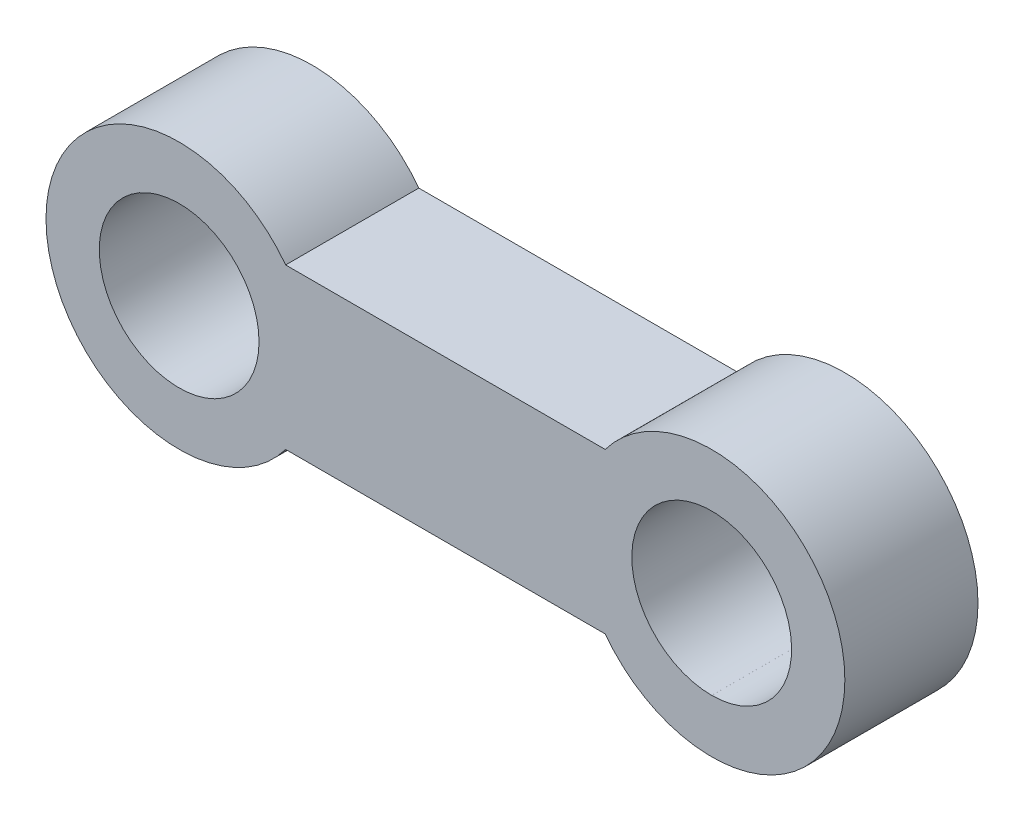
ISO-10303-21;
HEADER;
FILE_DESCRIPTION(('STEP AP214'),'2;1');
FILE_NAME('part.step','',(''),(''),'','','');
FILE_SCHEMA(('AUTOMOTIVE_DESIGN { 1 0 10303 214 1 1 1 1 }'));
ENDSEC;
DATA;
#1=APPLICATION_CONTEXT('core data for automotive mechanical design processes');
#2=APPLICATION_PROTOCOL_DEFINITION('international standard','automotive_design',2000,#1);
#3=PRODUCT_CONTEXT('',#1,'mechanical');
#4=PRODUCT('Part','Part','',(#3));
#5=PRODUCT_RELATED_PRODUCT_CATEGORY('part','',(#4));
#6=PRODUCT_DEFINITION_FORMATION('','',#4);
#7=PRODUCT_DEFINITION_CONTEXT('part definition',#1,'design');
#8=PRODUCT_DEFINITION('design','',#6,#7);
#9=PRODUCT_DEFINITION_SHAPE('','',#8);
#10=(LENGTH_UNIT() NAMED_UNIT(*) SI_UNIT(.MILLI.,.METRE.));
#11=(NAMED_UNIT(*) PLANE_ANGLE_UNIT() SI_UNIT($,.RADIAN.));
#12=(NAMED_UNIT(*) SI_UNIT($,.STERADIAN.) SOLID_ANGLE_UNIT());
#13=UNCERTAINTY_MEASURE_WITH_UNIT(LENGTH_MEASURE(1.E-05),#10,'distance_accuracy_value','');
#14=(GEOMETRIC_REPRESENTATION_CONTEXT(3) GLOBAL_UNCERTAINTY_ASSIGNED_CONTEXT((#13)) GLOBAL_UNIT_ASSIGNED_CONTEXT((#10,
#11,#12)) REPRESENTATION_CONTEXT('',''));
#15=CARTESIAN_POINT('',(0.,0.,0.));
#16=DIRECTION('',(0.,0.,1.));
#17=DIRECTION('',(1.,0.,0.));
#18=AXIS2_PLACEMENT_3D('',#15,#16,#17);
#19=CARTESIAN_POINT('',(0.,-3.,5.));
#20=DIRECTION('',(0.,1.,0.));
#21=DIRECTION('',(0.,0.,1.));
#22=AXIS2_PLACEMENT_3D('',#19,#20,#21);
#23=PLANE('',#22);
#24=DIRECTION('',(1.,0.,0.));
#25=VECTOR('',#24,1.);
#26=CARTESIAN_POINT('',(0.,-3.,0.));
#27=LINE('',#26,#25);
#28=CARTESIAN_POINT('',(4.,-3.,0.));
#29=VERTEX_POINT('',#28);
#30=CARTESIAN_POINT('',(16.,-3.,0.));
#31=VERTEX_POINT('',#30);
#32=EDGE_CURVE('E124',#29,#31,#27,.T.);
#33=ORIENTED_EDGE('',*,*,#32,.T.);
#34=DIRECTION('',(0.,0.,-1.));
#35=VECTOR('',#34,1.);
#36=CARTESIAN_POINT('',(16.,-3.,5.));
#37=LINE('',#36,#35);
#38=CARTESIAN_POINT('',(16.,-3.,5.));
#39=VERTEX_POINT('',#38);
#40=EDGE_CURVE('E11',#39,#31,#37,.T.);
#41=ORIENTED_EDGE('',*,*,#40,.F.);
#42=DIRECTION('',(1.,0.,0.));
#43=VECTOR('',#42,1.);
#44=CARTESIAN_POINT('',(0.,-3.,5.));
#45=LINE('',#44,#43);
#46=CARTESIAN_POINT('',(4.,-3.,5.));
#47=VERTEX_POINT('',#46);
#48=EDGE_CURVE('E98',#47,#39,#45,.T.);
#49=ORIENTED_EDGE('',*,*,#48,.F.);
#50=DIRECTION('',(0.,0.,-1.));
#51=VECTOR('',#50,1.);
#52=CARTESIAN_POINT('',(4.,-3.,5.));
#53=LINE('',#52,#51);
#54=EDGE_CURVE('E132',#47,#29,#53,.T.);
#55=ORIENTED_EDGE('',*,*,#54,.T.);
#56=EDGE_LOOP('',(#33,#41,#49,#55));
#57=FACE_BOUND('',#56,.T.);
#58=ADVANCED_FACE('F33',(#57),#23,.F.);
#59=CARTESIAN_POINT('',(20.,0.,5.));
#60=DIRECTION('',(0.,0.,-1.));
#61=DIRECTION('',(-1.,0.,0.));
#62=AXIS2_PLACEMENT_3D('',#59,#60,#61);
#63=CYLINDRICAL_SURFACE('',#62,5.);
#64=CARTESIAN_POINT('',(20.,0.,0.));
#65=DIRECTION('',(0.,0.,1.));
#66=DIRECTION('',(1.,0.,0.));
#67=AXIS2_PLACEMENT_3D('',#64,#65,#66);
#68=CIRCLE('',#67,5.);
#69=CARTESIAN_POINT('',(16.,3.,0.));
#70=VERTEX_POINT('',#69);
#71=EDGE_CURVE('E104',#31,#70,#68,.T.);
#72=ORIENTED_EDGE('',*,*,#71,.T.);
#73=DIRECTION('',(0.,0.,-1.));
#74=VECTOR('',#73,1.);
#75=CARTESIAN_POINT('',(16.,3.,5.));
#76=LINE('',#75,#74);
#77=CARTESIAN_POINT('',(16.,3.,5.));
#78=VERTEX_POINT('',#77);
#79=EDGE_CURVE('E43',#78,#70,#76,.T.);
#80=ORIENTED_EDGE('',*,*,#79,.F.);
#81=CARTESIAN_POINT('',(20.,0.,5.));
#82=DIRECTION('',(0.,0.,1.));
#83=DIRECTION('',(1.,0.,0.));
#84=AXIS2_PLACEMENT_3D('',#81,#82,#83);
#85=CIRCLE('',#84,5.);
#86=EDGE_CURVE('E92',#39,#78,#85,.T.);
#87=ORIENTED_EDGE('',*,*,#86,.F.);
#88=ORIENTED_EDGE('',*,*,#40,.T.);
#89=EDGE_LOOP('',(#72,#80,#87,#88));
#90=FACE_BOUND('',#89,.T.);
#91=ADVANCED_FACE('F103',(#90),#63,.T.);
#92=CARTESIAN_POINT('',(0.,3.,5.));
#93=DIRECTION('',(0.,1.,0.));
#94=DIRECTION('',(0.,0.,1.));
#95=AXIS2_PLACEMENT_3D('',#92,#93,#94);
#96=PLANE('',#95);
#97=DIRECTION('',(1.,0.,0.));
#98=VECTOR('',#97,1.);
#99=CARTESIAN_POINT('',(0.,3.,0.));
#100=LINE('',#99,#98);
#101=CARTESIAN_POINT('',(4.,3.,0.));
#102=VERTEX_POINT('',#101);
#103=EDGE_CURVE('E128',#102,#70,#100,.T.);
#104=ORIENTED_EDGE('',*,*,#103,.F.);
#105=DIRECTION('',(0.,0.,-1.));
#106=VECTOR('',#105,1.);
#107=CARTESIAN_POINT('',(4.,3.,5.));
#108=LINE('',#107,#106);
#109=CARTESIAN_POINT('',(4.,3.,5.));
#110=VERTEX_POINT('',#109);
#111=EDGE_CURVE('E74',#110,#102,#108,.T.);
#112=ORIENTED_EDGE('',*,*,#111,.F.);
#113=DIRECTION('',(1.,0.,0.));
#114=VECTOR('',#113,1.);
#115=CARTESIAN_POINT('',(0.,3.,5.));
#116=LINE('',#115,#114);
#117=EDGE_CURVE('E96',#110,#78,#116,.T.);
#118=ORIENTED_EDGE('',*,*,#117,.T.);
#119=ORIENTED_EDGE('',*,*,#79,.T.);
#120=EDGE_LOOP('',(#104,#112,#118,#119));
#121=FACE_BOUND('',#120,.T.);
#122=ADVANCED_FACE('F109',(#121),#96,.T.);
#123=CARTESIAN_POINT('',(20.,0.,5.));
#124=DIRECTION('',(0.,0.,-1.));
#125=DIRECTION('',(-1.,0.,0.));
#126=AXIS2_PLACEMENT_3D('',#123,#124,#125);
#127=CYLINDRICAL_SURFACE('',#126,3.);
#128=CARTESIAN_POINT('',(20.,0.,0.));
#129=DIRECTION('',(0.,0.,1.));
#130=DIRECTION('',(1.,0.,0.));
#131=AXIS2_PLACEMENT_3D('',#128,#129,#130);
#132=CIRCLE('',#131,3.);
#133=CARTESIAN_POINT('',(20.0018338843937,-3.,0.));
#134=VERTEX_POINT('',#133);
#135=CARTESIAN_POINT('',(20.,-3.,0.));
#136=VERTEX_POINT('',#135);
#137=EDGE_CURVE('E115',#134,#136,#132,.T.);
#138=ORIENTED_EDGE('',*,*,#137,.F.);
#139=DIRECTION('',(0.,0.,-1.));
#140=VECTOR('',#139,1.);
#141=CARTESIAN_POINT('',(20.0018338843937,-3.,5.));
#142=LINE('',#141,#140);
#143=CARTESIAN_POINT('',(20.0018338843937,-3.,5.));
#144=VERTEX_POINT('',#143);
#145=EDGE_CURVE('E37',#144,#134,#142,.T.);
#146=ORIENTED_EDGE('',*,*,#145,.F.);
#147=CARTESIAN_POINT('',(20.,0.,5.));
#148=DIRECTION('',(0.,0.,1.));
#149=DIRECTION('',(1.,0.,0.));
#150=AXIS2_PLACEMENT_3D('',#147,#148,#149);
#151=CIRCLE('',#150,3.);
#152=CARTESIAN_POINT('',(20.,-3.,5.));
#153=VERTEX_POINT('',#152);
#154=EDGE_CURVE('E131',#144,#153,#151,.T.);
#155=ORIENTED_EDGE('',*,*,#154,.T.);
#156=DIRECTION('',(0.,0.,-1.));
#157=VECTOR('',#156,1.);
#158=CARTESIAN_POINT('',(20.,-3.,5.));
#159=LINE('',#158,#157);
#160=EDGE_CURVE('E111',#153,#136,#159,.T.);
#161=ORIENTED_EDGE('',*,*,#160,.T.);
#162=EDGE_LOOP('',(#138,#146,#155,#161));
#163=FACE_BOUND('',#162,.T.);
#164=ADVANCED_FACE('F35',(#163),#127,.F.);
#165=CARTESIAN_POINT('',(0.,0.,5.));
#166=DIRECTION('',(0.,0.,-1.));
#167=DIRECTION('',(-1.,0.,0.));
#168=AXIS2_PLACEMENT_3D('',#165,#166,#167);
#169=CYLINDRICAL_SURFACE('',#168,3.);
#170=CARTESIAN_POINT('',(0.,0.,5.));
#171=DIRECTION('',(0.,0.,1.));
#172=DIRECTION('',(1.,0.,0.));
#173=AXIS2_PLACEMENT_3D('',#170,#171,#172);
#174=CIRCLE('',#173,3.);
#175=CARTESIAN_POINT('',(3.,0.,5.));
#176=VERTEX_POINT('',#175);
#177=EDGE_CURVE('E175',#176,#176,#174,.T.);
#178=ORIENTED_EDGE('',*,*,#177,.T.);
#179=EDGE_LOOP('',(#178));
#180=FACE_BOUND('',#179,.T.);
#181=CARTESIAN_POINT('',(0.,0.,0.));
#182=DIRECTION('',(0.,0.,1.));
#183=DIRECTION('',(1.,0.,0.));
#184=AXIS2_PLACEMENT_3D('',#181,#182,#183);
#185=CIRCLE('',#184,3.);
#186=CARTESIAN_POINT('',(3.,0.,0.));
#187=VERTEX_POINT('',#186);
#188=EDGE_CURVE('E121',#187,#187,#185,.T.);
#189=ORIENTED_EDGE('',*,*,#188,.F.);
#190=EDGE_LOOP('',(#189));
#191=FACE_BOUND('',#190,.T.);
#192=ADVANCED_FACE('F158',(#180,#191),#169,.F.);
#193=CARTESIAN_POINT('',(0.,-3.,5.));
#194=DIRECTION('',(0.,1.,0.));
#195=DIRECTION('',(0.,0.,1.));
#196=AXIS2_PLACEMENT_3D('',#193,#194,#195);
#197=PLANE('',#196);
#198=DIRECTION('',(1.,0.,0.));
#199=VECTOR('',#198,1.);
#200=CARTESIAN_POINT('',(0.,-3.,0.));
#201=LINE('',#200,#199);
#202=EDGE_CURVE('E118',#136,#134,#201,.T.);
#203=ORIENTED_EDGE('',*,*,#202,.F.);
#204=ORIENTED_EDGE('',*,*,#160,.F.);
#205=DIRECTION('',(1.,0.,0.));
#206=VECTOR('',#205,1.);
#207=CARTESIAN_POINT('',(0.,-3.,5.));
#208=LINE('',#207,#206);
#209=EDGE_CURVE('E139',#153,#144,#208,.T.);
#210=ORIENTED_EDGE('',*,*,#209,.T.);
#211=ORIENTED_EDGE('',*,*,#145,.T.);
#212=EDGE_LOOP('',(#203,#204,#210,#211));
#213=FACE_BOUND('',#212,.T.);
#214=ADVANCED_FACE('F137',(#213),#197,.T.);
#215=CARTESIAN_POINT('',(0.,0.,5.));
#216=DIRECTION('',(0.,0.,-1.));
#217=DIRECTION('',(-1.,0.,0.));
#218=AXIS2_PLACEMENT_3D('',#215,#216,#217);
#219=CYLINDRICAL_SURFACE('',#218,5.);
#220=CARTESIAN_POINT('',(0.,0.,0.));
#221=DIRECTION('',(0.,0.,1.));
#222=DIRECTION('',(1.,0.,0.));
#223=AXIS2_PLACEMENT_3D('',#220,#221,#222);
#224=CIRCLE('',#223,5.);
#225=EDGE_CURVE('E77',#102,#29,#224,.T.);
#226=ORIENTED_EDGE('',*,*,#225,.T.);
#227=ORIENTED_EDGE('',*,*,#54,.F.);
#228=CARTESIAN_POINT('',(0.,0.,5.));
#229=DIRECTION('',(0.,0.,1.));
#230=DIRECTION('',(1.,0.,0.));
#231=AXIS2_PLACEMENT_3D('',#228,#229,#230);
#232=CIRCLE('',#231,5.);
#233=EDGE_CURVE('E52',#110,#47,#232,.T.);
#234=ORIENTED_EDGE('',*,*,#233,.F.);
#235=ORIENTED_EDGE('',*,*,#111,.T.);
#236=EDGE_LOOP('',(#226,#227,#234,#235));
#237=FACE_BOUND('',#236,.T.);
#238=ADVANCED_FACE('F149',(#237),#219,.T.);
#239=CARTESIAN_POINT('',(0.,0.,5.));
#240=DIRECTION('',(0.,0.,1.));
#241=DIRECTION('',(1.,0.,0.));
#242=AXIS2_PLACEMENT_3D('',#239,#240,#241);
#243=PLANE('',#242);
#244=ORIENTED_EDGE('',*,*,#154,.F.);
#245=ORIENTED_EDGE('',*,*,#209,.F.);
#246=EDGE_LOOP('',(#244,#245));
#247=FACE_BOUND('',#246,.T.);
#248=ORIENTED_EDGE('',*,*,#177,.F.);
#249=EDGE_LOOP('',(#248));
#250=FACE_BOUND('',#249,.T.);
#251=ORIENTED_EDGE('',*,*,#48,.T.);
#252=ORIENTED_EDGE('',*,*,#86,.T.);
#253=ORIENTED_EDGE('',*,*,#117,.F.);
#254=ORIENTED_EDGE('',*,*,#233,.T.);
#255=EDGE_LOOP('',(#251,#252,#253,#254));
#256=FACE_BOUND('',#255,.T.);
#257=ADVANCED_FACE('F94',(#247,#250,#256),#243,.T.);
#258=CARTESIAN_POINT('',(0.,0.,0.));
#259=DIRECTION('',(0.,0.,1.));
#260=DIRECTION('',(1.,0.,0.));
#261=AXIS2_PLACEMENT_3D('',#258,#259,#260);
#262=PLANE('',#261);
#263=ORIENTED_EDGE('',*,*,#137,.T.);
#264=ORIENTED_EDGE('',*,*,#202,.T.);
#265=EDGE_LOOP('',(#263,#264));
#266=FACE_BOUND('',#265,.T.);
#267=ORIENTED_EDGE('',*,*,#188,.T.);
#268=EDGE_LOOP('',(#267));
#269=FACE_BOUND('',#268,.T.);
#270=ORIENTED_EDGE('',*,*,#32,.F.);
#271=ORIENTED_EDGE('',*,*,#225,.F.);
#272=ORIENTED_EDGE('',*,*,#103,.T.);
#273=ORIENTED_EDGE('',*,*,#71,.F.);
#274=EDGE_LOOP('',(#270,#271,#272,#273));
#275=FACE_BOUND('',#274,.T.);
#276=ADVANCED_FACE('F141',(#266,#269,#275),#262,.F.);
#277=CLOSED_SHELL('',(#58,#91,#122,#164,#192,#214,#238,#257,#276));
#278=MANIFOLD_SOLID_BREP('B2',#277);
#279=ADVANCED_BREP_SHAPE_REPRESENTATION('',(#18,#278),#14);
#280=SHAPE_DEFINITION_REPRESENTATION(#9,#279);
ENDSEC;
END-ISO-10303-21;
